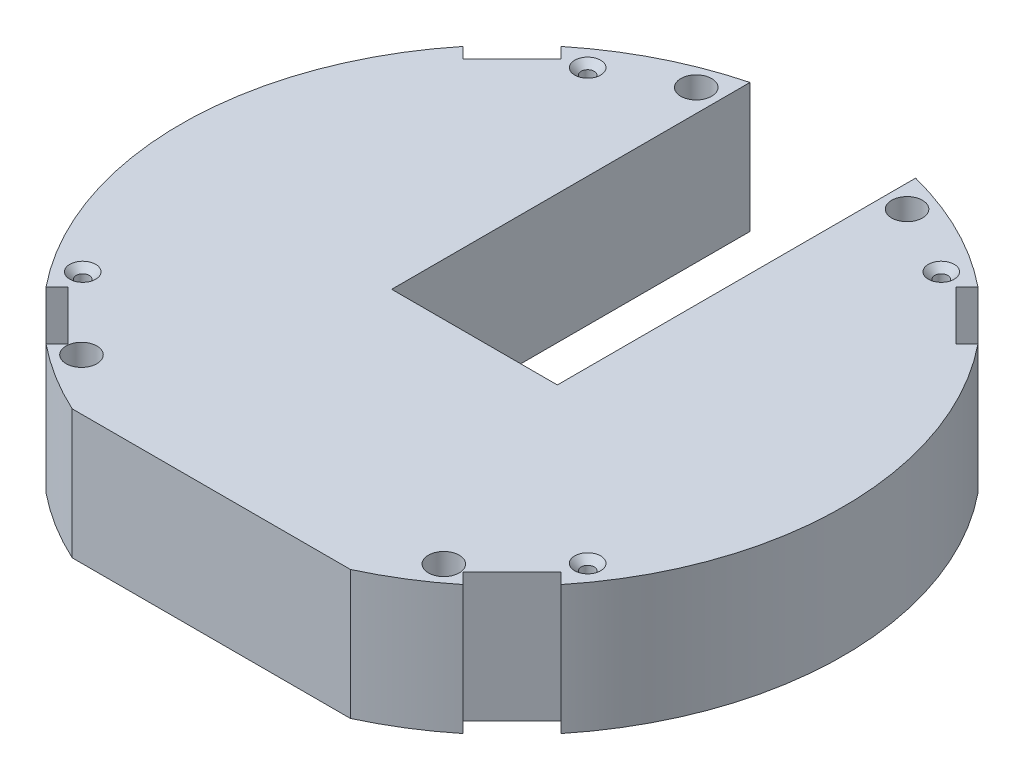
ISO-10303-21;
HEADER;
FILE_DESCRIPTION(('STEP AP214'),'2;1');
FILE_NAME('part.step','',(''),(''),'','','');
FILE_SCHEMA(('AUTOMOTIVE_DESIGN { 1 0 10303 214 1 1 1 1 }'));
ENDSEC;
DATA;
#1=APPLICATION_CONTEXT('core data for automotive mechanical design processes');
#2=APPLICATION_PROTOCOL_DEFINITION('international standard','automotive_design',2000,#1);
#3=PRODUCT_CONTEXT('',#1,'mechanical');
#4=PRODUCT('Part','Part','',(#3));
#5=PRODUCT_RELATED_PRODUCT_CATEGORY('part','',(#4));
#6=PRODUCT_DEFINITION_FORMATION('','',#4);
#7=PRODUCT_DEFINITION_CONTEXT('part definition',#1,'design');
#8=PRODUCT_DEFINITION('design','',#6,#7);
#9=PRODUCT_DEFINITION_SHAPE('','',#8);
#10=(LENGTH_UNIT() NAMED_UNIT(*) SI_UNIT(.MILLI.,.METRE.));
#11=(NAMED_UNIT(*) PLANE_ANGLE_UNIT() SI_UNIT($,.RADIAN.));
#12=(NAMED_UNIT(*) SI_UNIT($,.STERADIAN.) SOLID_ANGLE_UNIT());
#13=UNCERTAINTY_MEASURE_WITH_UNIT(LENGTH_MEASURE(1.E-05),#10,'distance_accuracy_value','');
#14=(GEOMETRIC_REPRESENTATION_CONTEXT(3) GLOBAL_UNCERTAINTY_ASSIGNED_CONTEXT((#13)) GLOBAL_UNIT_ASSIGNED_CONTEXT((#10,
#11,#12)) REPRESENTATION_CONTEXT('',''));
#15=CARTESIAN_POINT('',(0.,0.,0.));
#16=DIRECTION('',(0.,0.,1.));
#17=DIRECTION('',(1.,0.,0.));
#18=AXIS2_PLACEMENT_3D('',#15,#16,#17);
#19=CARTESIAN_POINT('',(0.,33.5,0.));
#20=DIRECTION('',(0.,-1.,0.));
#21=DIRECTION('',(0.,0.,-1.));
#22=AXIS2_PLACEMENT_3D('',#19,#20,#21);
#23=CYLINDRICAL_SURFACE('',#22,86.);
#24=CARTESIAN_POINT('',(0.,0.,0.));
#25=DIRECTION('',(0.,1.,0.));
#26=DIRECTION('',(0.,0.,1.));
#27=AXIS2_PLACEMENT_3D('',#24,#25,#26);
#28=CIRCLE('',#27,86.);
#29=CARTESIAN_POINT('',(-54.1133074261554,0.,66.8412294875132));
#30=VERTEX_POINT('',#29);
#31=CARTESIAN_POINT('',(-36.1,0.,78.0563258166819));
#32=VERTEX_POINT('',#31);
#33=EDGE_CURVE('E339',#30,#32,#28,.T.);
#34=ORIENTED_EDGE('',*,*,#33,.T.);
#35=DIRECTION('',(0.,-1.,0.));
#36=VECTOR('',#35,1.);
#37=CARTESIAN_POINT('',(-36.1,33.5,78.0563258166819));
#38=LINE('',#37,#36);
#39=CARTESIAN_POINT('',(-36.1,33.5,78.0563258166819));
#40=VERTEX_POINT('',#39);
#41=EDGE_CURVE('E11',#40,#32,#38,.T.);
#42=ORIENTED_EDGE('',*,*,#41,.F.);
#43=CARTESIAN_POINT('',(0.,33.5,0.));
#44=DIRECTION('',(0.,1.,0.));
#45=DIRECTION('',(0.,0.,1.));
#46=AXIS2_PLACEMENT_3D('',#43,#44,#45);
#47=CIRCLE('',#46,86.);
#48=CARTESIAN_POINT('',(-54.1133074261554,33.5,66.8412294875132));
#49=VERTEX_POINT('',#48);
#50=EDGE_CURVE('E340',#49,#40,#47,.T.);
#51=ORIENTED_EDGE('',*,*,#50,.F.);
#52=DIRECTION('',(0.,-1.,0.));
#53=VECTOR('',#52,1.);
#54=CARTESIAN_POINT('',(-54.1133074261554,33.5,66.8412294875132));
#55=LINE('',#54,#53);
#56=EDGE_CURVE('E364',#49,#30,#55,.T.);
#57=ORIENTED_EDGE('',*,*,#56,.T.);
#58=EDGE_LOOP('',(#34,#42,#51,#57));
#59=FACE_BOUND('',#58,.T.);
#60=ADVANCED_FACE('F37',(#59),#23,.T.);
#61=CARTESIAN_POINT('',(-36.1,33.5,78.0563258166819));
#62=DIRECTION('',(0.,0.,-1.));
#63=DIRECTION('',(-1.,0.,0.));
#64=AXIS2_PLACEMENT_3D('',#61,#62,#63);
#65=PLANE('',#64);
#66=DIRECTION('',(1.,0.,0.));
#67=VECTOR('',#66,1.);
#68=CARTESIAN_POINT('',(-36.1,0.,78.0563258166819));
#69=LINE('',#68,#67);
#70=CARTESIAN_POINT('',(36.1,0.,78.0563258166819));
#71=VERTEX_POINT('',#70);
#72=EDGE_CURVE('E367',#32,#71,#69,.T.);
#73=ORIENTED_EDGE('',*,*,#72,.T.);
#74=DIRECTION('',(0.,-1.,0.));
#75=VECTOR('',#74,1.);
#76=CARTESIAN_POINT('',(36.1,33.5,78.0563258166819));
#77=LINE('',#76,#75);
#78=CARTESIAN_POINT('',(36.1,33.5,78.0563258166819));
#79=VERTEX_POINT('',#78);
#80=EDGE_CURVE('E44',#79,#71,#77,.T.);
#81=ORIENTED_EDGE('',*,*,#80,.F.);
#82=DIRECTION('',(1.,0.,0.));
#83=VECTOR('',#82,1.);
#84=CARTESIAN_POINT('',(-36.1,33.5,78.0563258166819));
#85=LINE('',#84,#83);
#86=EDGE_CURVE('E343',#40,#79,#85,.T.);
#87=ORIENTED_EDGE('',*,*,#86,.F.);
#88=ORIENTED_EDGE('',*,*,#41,.T.);
#89=EDGE_LOOP('',(#73,#81,#87,#88));
#90=FACE_BOUND('',#89,.T.);
#91=ADVANCED_FACE('F462',(#90),#65,.F.);
#92=CARTESIAN_POINT('',(0.,33.5,0.));
#93=DIRECTION('',(0.,-1.,0.));
#94=DIRECTION('',(0.,0.,-1.));
#95=AXIS2_PLACEMENT_3D('',#92,#93,#94);
#96=CYLINDRICAL_SURFACE('',#95,86.);
#97=CARTESIAN_POINT('',(0.,0.,0.));
#98=DIRECTION('',(0.,1.,0.));
#99=DIRECTION('',(0.,0.,1.));
#100=AXIS2_PLACEMENT_3D('',#97,#98,#99);
#101=CIRCLE('',#100,86.);
#102=CARTESIAN_POINT('',(54.1133074261554,0.,66.8412294875132));
#103=VERTEX_POINT('',#102);
#104=EDGE_CURVE('E369',#71,#103,#101,.T.);
#105=ORIENTED_EDGE('',*,*,#104,.T.);
#106=DIRECTION('',(0.,-1.,0.));
#107=VECTOR('',#106,1.);
#108=CARTESIAN_POINT('',(54.1133074261554,33.5,66.8412294875132));
#109=LINE('',#108,#107);
#110=CARTESIAN_POINT('',(54.1133074261554,33.5,66.8412294875132));
#111=VERTEX_POINT('',#110);
#112=EDGE_CURVE('E417',#111,#103,#109,.T.);
#113=ORIENTED_EDGE('',*,*,#112,.F.);
#114=CARTESIAN_POINT('',(0.,33.5,0.));
#115=DIRECTION('',(0.,1.,0.));
#116=DIRECTION('',(0.,0.,1.));
#117=AXIS2_PLACEMENT_3D('',#114,#115,#116);
#118=CIRCLE('',#117,86.);
#119=EDGE_CURVE('E210',#79,#111,#118,.T.);
#120=ORIENTED_EDGE('',*,*,#119,.F.);
#121=ORIENTED_EDGE('',*,*,#80,.T.);
#122=EDGE_LOOP('',(#105,#113,#120,#121));
#123=FACE_BOUND('',#122,.T.);
#124=ADVANCED_FACE('F422',(#123),#96,.T.);
#125=CARTESIAN_POINT('',(0.,33.5,0.));
#126=DIRECTION('',(0.,-1.,0.));
#127=DIRECTION('',(0.,0.,-1.));
#128=AXIS2_PLACEMENT_3D('',#125,#126,#127);
#129=CYLINDRICAL_SURFACE('',#128,86.);
#130=CARTESIAN_POINT('',(0.,0.,0.));
#131=DIRECTION('',(0.,1.,0.));
#132=DIRECTION('',(0.,0.,1.));
#133=AXIS2_PLACEMENT_3D('',#130,#131,#132);
#134=CIRCLE('',#133,86.);
#135=CARTESIAN_POINT('',(66.8412294875132,0.,54.1133074261553));
#136=VERTEX_POINT('',#135);
#137=CARTESIAN_POINT('',(66.8412294875132,0.,-54.1133074261553));
#138=VERTEX_POINT('',#137);
#139=EDGE_CURVE('E372',#136,#138,#134,.T.);
#140=ORIENTED_EDGE('',*,*,#139,.T.);
#141=DIRECTION('',(0.,-1.,0.));
#142=VECTOR('',#141,1.);
#143=CARTESIAN_POINT('',(66.8412294875132,33.5,-54.1133074261553));
#144=LINE('',#143,#142);
#145=CARTESIAN_POINT('',(66.8412294875132,33.5,-54.1133074261553));
#146=VERTEX_POINT('',#145);
#147=EDGE_CURVE('E412',#146,#138,#144,.T.);
#148=ORIENTED_EDGE('',*,*,#147,.F.);
#149=CARTESIAN_POINT('',(0.,33.5,0.));
#150=DIRECTION('',(0.,1.,0.));
#151=DIRECTION('',(0.,0.,1.));
#152=AXIS2_PLACEMENT_3D('',#149,#150,#151);
#153=CIRCLE('',#152,86.);
#154=CARTESIAN_POINT('',(66.8412294875132,33.5,54.1133074261553));
#155=VERTEX_POINT('',#154);
#156=EDGE_CURVE('E347',#155,#146,#153,.T.);
#157=ORIENTED_EDGE('',*,*,#156,.F.);
#158=DIRECTION('',(0.,-1.,0.));
#159=VECTOR('',#158,1.);
#160=CARTESIAN_POINT('',(66.8412294875132,33.5,54.1133074261553));
#161=LINE('',#160,#159);
#162=EDGE_CURVE('E414',#155,#136,#161,.T.);
#163=ORIENTED_EDGE('',*,*,#162,.T.);
#164=EDGE_LOOP('',(#140,#148,#157,#163));
#165=FACE_BOUND('',#164,.T.);
#166=ADVANCED_FACE('F435',(#165),#129,.T.);
#167=CARTESIAN_POINT('',(0.,33.5,0.));
#168=DIRECTION('',(0.,-1.,0.));
#169=DIRECTION('',(0.,0.,-1.));
#170=AXIS2_PLACEMENT_3D('',#167,#168,#169);
#171=CYLINDRICAL_SURFACE('',#170,86.);
#172=CARTESIAN_POINT('',(0.,0.,0.));
#173=DIRECTION('',(0.,1.,0.));
#174=DIRECTION('',(0.,0.,1.));
#175=AXIS2_PLACEMENT_3D('',#172,#173,#174);
#176=CIRCLE('',#175,86.);
#177=CARTESIAN_POINT('',(54.1133074261554,0.,-66.8412294875132));
#178=VERTEX_POINT('',#177);
#179=CARTESIAN_POINT('',(21.5,0.,-83.2691419434595));
#180=VERTEX_POINT('',#179);
#181=EDGE_CURVE('E375',#178,#180,#176,.T.);
#182=ORIENTED_EDGE('',*,*,#181,.T.);
#183=DIRECTION('',(0.,-1.,0.));
#184=VECTOR('',#183,1.);
#185=CARTESIAN_POINT('',(21.5,33.5,-83.2691419434595));
#186=LINE('',#185,#184);
#187=CARTESIAN_POINT('',(21.5,33.5,-83.2691419434595));
#188=VERTEX_POINT('',#187);
#189=EDGE_CURVE('E406',#188,#180,#186,.T.);
#190=ORIENTED_EDGE('',*,*,#189,.F.);
#191=CARTESIAN_POINT('',(0.,33.5,0.));
#192=DIRECTION('',(0.,1.,0.));
#193=DIRECTION('',(0.,0.,1.));
#194=AXIS2_PLACEMENT_3D('',#191,#192,#193);
#195=CIRCLE('',#194,86.);
#196=CARTESIAN_POINT('',(54.1133074261554,33.5,-66.8412294875132));
#197=VERTEX_POINT('',#196);
#198=EDGE_CURVE('E350',#197,#188,#195,.T.);
#199=ORIENTED_EDGE('',*,*,#198,.F.);
#200=DIRECTION('',(0.,-1.,0.));
#201=VECTOR('',#200,1.);
#202=CARTESIAN_POINT('',(54.1133074261553,33.5,-66.8412294875132));
#203=LINE('',#202,#201);
#204=EDGE_CURVE('E409',#197,#178,#203,.T.);
#205=ORIENTED_EDGE('',*,*,#204,.T.);
#206=EDGE_LOOP('',(#182,#190,#199,#205));
#207=FACE_BOUND('',#206,.T.);
#208=ADVANCED_FACE('F446',(#207),#171,.T.);
#209=CARTESIAN_POINT('',(21.5,33.5,-83.2691419434595));
#210=DIRECTION('',(1.,0.,0.));
#211=DIRECTION('',(0.,0.,-1.));
#212=AXIS2_PLACEMENT_3D('',#209,#210,#211);
#213=PLANE('',#212);
#214=DIRECTION('',(0.,0.,1.));
#215=VECTOR('',#214,1.);
#216=CARTESIAN_POINT('',(21.5,0.,-83.2691419434595));
#217=LINE('',#216,#215);
#218=CARTESIAN_POINT('',(21.5,0.,9.73085805654054));
#219=VERTEX_POINT('',#218);
#220=EDGE_CURVE('E377',#180,#219,#217,.T.);
#221=ORIENTED_EDGE('',*,*,#220,.T.);
#222=DIRECTION('',(0.,-1.,0.));
#223=VECTOR('',#222,1.);
#224=CARTESIAN_POINT('',(21.5,33.5,9.73085805654054));
#225=LINE('',#224,#223);
#226=CARTESIAN_POINT('',(21.5,33.5,9.73085805654054));
#227=VERTEX_POINT('',#226);
#228=EDGE_CURVE('E403',#227,#219,#225,.T.);
#229=ORIENTED_EDGE('',*,*,#228,.F.);
#230=DIRECTION('',(0.,0.,1.));
#231=VECTOR('',#230,1.);
#232=CARTESIAN_POINT('',(21.5,33.5,-83.2691419434595));
#233=LINE('',#232,#231);
#234=EDGE_CURVE('E352',#188,#227,#233,.T.);
#235=ORIENTED_EDGE('',*,*,#234,.F.);
#236=ORIENTED_EDGE('',*,*,#189,.T.);
#237=EDGE_LOOP('',(#221,#229,#235,#236));
#238=FACE_BOUND('',#237,.T.);
#239=ADVANCED_FACE('F508',(#238),#213,.F.);
#240=CARTESIAN_POINT('',(-21.5,33.5,9.73085805654054));
#241=DIRECTION('',(0.,0.,1.));
#242=DIRECTION('',(1.,0.,0.));
#243=AXIS2_PLACEMENT_3D('',#240,#241,#242);
#244=PLANE('',#243);
#245=DIRECTION('',(-1.,0.,0.));
#246=VECTOR('',#245,1.);
#247=CARTESIAN_POINT('',(-21.5,0.,9.73085805654054));
#248=LINE('',#247,#246);
#249=CARTESIAN_POINT('',(-21.5,0.,9.73085805654054));
#250=VERTEX_POINT('',#249);
#251=EDGE_CURVE('E379',#219,#250,#248,.T.);
#252=ORIENTED_EDGE('',*,*,#251,.T.);
#253=DIRECTION('',(0.,-1.,0.));
#254=VECTOR('',#253,1.);
#255=CARTESIAN_POINT('',(-21.5,33.5,9.73085805654054));
#256=LINE('',#255,#254);
#257=CARTESIAN_POINT('',(-21.5,33.5,9.73085805654054));
#258=VERTEX_POINT('',#257);
#259=EDGE_CURVE('E400',#258,#250,#256,.T.);
#260=ORIENTED_EDGE('',*,*,#259,.F.);
#261=DIRECTION('',(-1.,0.,0.));
#262=VECTOR('',#261,1.);
#263=CARTESIAN_POINT('',(-21.5,33.5,9.73085805654054));
#264=LINE('',#263,#262);
#265=EDGE_CURVE('E354',#227,#258,#264,.T.);
#266=ORIENTED_EDGE('',*,*,#265,.F.);
#267=ORIENTED_EDGE('',*,*,#228,.T.);
#268=EDGE_LOOP('',(#252,#260,#266,#267));
#269=FACE_BOUND('',#268,.T.);
#270=ADVANCED_FACE('F505',(#269),#244,.F.);
#271=CARTESIAN_POINT('',(-21.5,33.5,-83.2691419434595));
#272=DIRECTION('',(-1.,0.,0.));
#273=DIRECTION('',(0.,0.,1.));
#274=AXIS2_PLACEMENT_3D('',#271,#272,#273);
#275=PLANE('',#274);
#276=DIRECTION('',(0.,0.,-1.));
#277=VECTOR('',#276,1.);
#278=CARTESIAN_POINT('',(-21.5,0.,-83.2691419434595));
#279=LINE('',#278,#277);
#280=CARTESIAN_POINT('',(-21.5,0.,-83.2691419434595));
#281=VERTEX_POINT('',#280);
#282=EDGE_CURVE('E381',#250,#281,#279,.T.);
#283=ORIENTED_EDGE('',*,*,#282,.T.);
#284=DIRECTION('',(0.,-1.,0.));
#285=VECTOR('',#284,1.);
#286=CARTESIAN_POINT('',(-21.5,33.5,-83.2691419434595));
#287=LINE('',#286,#285);
#288=CARTESIAN_POINT('',(-21.5,33.5,-83.2691419434595));
#289=VERTEX_POINT('',#288);
#290=EDGE_CURVE('E397',#289,#281,#287,.T.);
#291=ORIENTED_EDGE('',*,*,#290,.F.);
#292=DIRECTION('',(0.,0.,-1.));
#293=VECTOR('',#292,1.);
#294=CARTESIAN_POINT('',(-21.5,33.5,-83.2691419434595));
#295=LINE('',#294,#293);
#296=EDGE_CURVE('E356',#258,#289,#295,.T.);
#297=ORIENTED_EDGE('',*,*,#296,.F.);
#298=ORIENTED_EDGE('',*,*,#259,.T.);
#299=EDGE_LOOP('',(#283,#291,#297,#298));
#300=FACE_BOUND('',#299,.T.);
#301=ADVANCED_FACE('F501',(#300),#275,.F.);
#302=CARTESIAN_POINT('',(0.,33.5,0.));
#303=DIRECTION('',(0.,-1.,0.));
#304=DIRECTION('',(0.,0.,-1.));
#305=AXIS2_PLACEMENT_3D('',#302,#303,#304);
#306=CYLINDRICAL_SURFACE('',#305,86.);
#307=CARTESIAN_POINT('',(0.,0.,0.));
#308=DIRECTION('',(0.,1.,0.));
#309=DIRECTION('',(0.,0.,1.));
#310=AXIS2_PLACEMENT_3D('',#307,#308,#309);
#311=CIRCLE('',#310,86.);
#312=CARTESIAN_POINT('',(-54.1133074261554,0.,-66.8412294875132));
#313=VERTEX_POINT('',#312);
#314=EDGE_CURVE('E383',#281,#313,#311,.T.);
#315=ORIENTED_EDGE('',*,*,#314,.T.);
#316=DIRECTION('',(0.,-1.,0.));
#317=VECTOR('',#316,1.);
#318=CARTESIAN_POINT('',(-54.1133074261553,33.5,-66.8412294875132));
#319=LINE('',#318,#317);
#320=CARTESIAN_POINT('',(-54.1133074261554,33.5,-66.8412294875132));
#321=VERTEX_POINT('',#320);
#322=EDGE_CURVE('E395',#321,#313,#319,.T.);
#323=ORIENTED_EDGE('',*,*,#322,.F.);
#324=CARTESIAN_POINT('',(0.,33.5,0.));
#325=DIRECTION('',(0.,1.,0.));
#326=DIRECTION('',(0.,0.,1.));
#327=AXIS2_PLACEMENT_3D('',#324,#325,#326);
#328=CIRCLE('',#327,86.);
#329=EDGE_CURVE('E358',#289,#321,#328,.T.);
#330=ORIENTED_EDGE('',*,*,#329,.F.);
#331=ORIENTED_EDGE('',*,*,#290,.T.);
#332=EDGE_LOOP('',(#315,#323,#330,#331));
#333=FACE_BOUND('',#332,.T.);
#334=ADVANCED_FACE('F496',(#333),#306,.T.);
#335=CARTESIAN_POINT('',(0.,33.5,0.));
#336=DIRECTION('',(0.,-1.,0.));
#337=DIRECTION('',(0.,0.,-1.));
#338=AXIS2_PLACEMENT_3D('',#335,#336,#337);
#339=CYLINDRICAL_SURFACE('',#338,86.);
#340=CARTESIAN_POINT('',(0.,0.,0.));
#341=DIRECTION('',(0.,1.,0.));
#342=DIRECTION('',(0.,0.,1.));
#343=AXIS2_PLACEMENT_3D('',#340,#341,#342);
#344=CIRCLE('',#343,86.);
#345=CARTESIAN_POINT('',(-66.8412294875132,0.,-54.1133074261553));
#346=VERTEX_POINT('',#345);
#347=CARTESIAN_POINT('',(-66.8412294875132,0.,54.1133074261553));
#348=VERTEX_POINT('',#347);
#349=EDGE_CURVE('E344',#346,#348,#344,.T.);
#350=ORIENTED_EDGE('',*,*,#349,.T.);
#351=DIRECTION('',(0.,-1.,0.));
#352=VECTOR('',#351,1.);
#353=CARTESIAN_POINT('',(-66.8412294875132,33.5,54.1133074261553));
#354=LINE('',#353,#352);
#355=CARTESIAN_POINT('',(-66.8412294875132,33.5,54.1133074261553));
#356=VERTEX_POINT('',#355);
#357=EDGE_CURVE('E390',#356,#348,#354,.T.);
#358=ORIENTED_EDGE('',*,*,#357,.F.);
#359=CARTESIAN_POINT('',(0.,33.5,0.));
#360=DIRECTION('',(0.,1.,0.));
#361=DIRECTION('',(0.,0.,1.));
#362=AXIS2_PLACEMENT_3D('',#359,#360,#361);
#363=CIRCLE('',#362,86.);
#364=CARTESIAN_POINT('',(-66.8412294875132,33.5,-54.1133074261553));
#365=VERTEX_POINT('',#364);
#366=EDGE_CURVE('E361',#365,#356,#363,.T.);
#367=ORIENTED_EDGE('',*,*,#366,.F.);
#368=DIRECTION('',(0.,-1.,0.));
#369=VECTOR('',#368,1.);
#370=CARTESIAN_POINT('',(-66.8412294875132,33.5,-54.1133074261553));
#371=LINE('',#370,#369);
#372=EDGE_CURVE('E392',#365,#346,#371,.T.);
#373=ORIENTED_EDGE('',*,*,#372,.T.);
#374=EDGE_LOOP('',(#350,#358,#367,#373));
#375=FACE_BOUND('',#374,.T.);
#376=ADVANCED_FACE('F483',(#375),#339,.T.);
#377=CARTESIAN_POINT('',(0.,33.5,0.));
#378=DIRECTION('',(0.,1.,0.));
#379=DIRECTION('',(0.,0.,1.));
#380=AXIS2_PLACEMENT_3D('',#377,#378,#379);
#381=PLANE('',#380);
#382=DIRECTION('',(-0.707106781186548,0.,-0.707106781186547));
#383=VECTOR('',#382,1.);
#384=CARTESIAN_POINT('',(-54.1133074261554,33.5,-66.8412294875132));
#385=LINE('',#384,#383);
#386=CARTESIAN_POINT('',(-51.2848803014092,33.5,-64.012802362767));
#387=VERTEX_POINT('',#386);
#388=EDGE_CURVE('E229',#387,#321,#385,.T.);
#389=ORIENTED_EDGE('',*,*,#388,.F.);
#390=DIRECTION('',(0.707106781186547,0.,-0.707106781186548));
#391=VECTOR('',#390,1.);
#392=CARTESIAN_POINT('',(-51.2848803014092,33.5,-64.012802362767));
#393=LINE('',#392,#391);
#394=CARTESIAN_POINT('',(-64.012802362767,33.5,-51.2848803014092));
#395=VERTEX_POINT('',#394);
#396=EDGE_CURVE('E247',#395,#387,#393,.T.);
#397=ORIENTED_EDGE('',*,*,#396,.F.);
#398=DIRECTION('',(0.707106781186551,0.,0.707106781186544));
#399=VECTOR('',#398,1.);
#400=CARTESIAN_POINT('',(-64.012802362767,33.5,-51.2848803014092));
#401=LINE('',#400,#399);
#402=EDGE_CURVE('E250',#365,#395,#401,.T.);
#403=ORIENTED_EDGE('',*,*,#402,.F.);
#404=ORIENTED_EDGE('',*,*,#366,.T.);
#405=DIRECTION('',(-0.707106781186551,0.,0.707106781186544));
#406=VECTOR('',#405,1.);
#407=CARTESIAN_POINT('',(-64.012802362767,33.5,51.2848803014092));
#408=LINE('',#407,#406);
#409=CARTESIAN_POINT('',(-64.012802362767,33.5,51.2848803014092));
#410=VERTEX_POINT('',#409);
#411=EDGE_CURVE('E212',#410,#356,#408,.T.);
#412=ORIENTED_EDGE('',*,*,#411,.F.);
#413=DIRECTION('',(-0.707106781186547,0.,-0.707106781186548));
#414=VECTOR('',#413,1.);
#415=CARTESIAN_POINT('',(-51.2848803014092,33.5,64.012802362767));
#416=LINE('',#415,#414);
#417=CARTESIAN_POINT('',(-51.2848803014092,33.5,64.012802362767));
#418=VERTEX_POINT('',#417);
#419=EDGE_CURVE('E265',#418,#410,#416,.T.);
#420=ORIENTED_EDGE('',*,*,#419,.F.);
#421=DIRECTION('',(0.707106781186548,0.,-0.707106781186547));
#422=VECTOR('',#421,1.);
#423=CARTESIAN_POINT('',(-54.1133074261554,33.5,66.8412294875132));
#424=LINE('',#423,#422);
#425=EDGE_CURVE('E214',#49,#418,#424,.T.);
#426=ORIENTED_EDGE('',*,*,#425,.F.);
#427=ORIENTED_EDGE('',*,*,#50,.T.);
#428=ORIENTED_EDGE('',*,*,#86,.T.);
#429=ORIENTED_EDGE('',*,*,#119,.T.);
#430=DIRECTION('',(0.707106781186548,0.,0.707106781186547));
#431=VECTOR('',#430,1.);
#432=CARTESIAN_POINT('',(54.1133074261554,33.5,66.8412294875132));
#433=LINE('',#432,#431);
#434=CARTESIAN_POINT('',(51.2848803014092,33.5,64.012802362767));
#435=VERTEX_POINT('',#434);
#436=EDGE_CURVE('E188',#435,#111,#433,.T.);
#437=ORIENTED_EDGE('',*,*,#436,.F.);
#438=DIRECTION('',(-0.707106781186547,0.,0.707106781186548));
#439=VECTOR('',#438,1.);
#440=CARTESIAN_POINT('',(51.2848803014092,33.5,64.012802362767));
#441=LINE('',#440,#439);
#442=CARTESIAN_POINT('',(64.012802362767,33.5,51.2848803014092));
#443=VERTEX_POINT('',#442);
#444=EDGE_CURVE('E198',#443,#435,#441,.T.);
#445=ORIENTED_EDGE('',*,*,#444,.F.);
#446=DIRECTION('',(-0.707106781186551,0.,-0.707106781186544));
#447=VECTOR('',#446,1.);
#448=CARTESIAN_POINT('',(64.012802362767,33.5,51.2848803014092));
#449=LINE('',#448,#447);
#450=EDGE_CURVE('E204',#155,#443,#449,.T.);
#451=ORIENTED_EDGE('',*,*,#450,.F.);
#452=ORIENTED_EDGE('',*,*,#156,.T.);
#453=DIRECTION('',(0.707106781186551,0.,-0.707106781186544));
#454=VECTOR('',#453,1.);
#455=CARTESIAN_POINT('',(64.012802362767,33.5,-51.2848803014092));
#456=LINE('',#455,#454);
#457=CARTESIAN_POINT('',(64.012802362767,33.5,-51.2848803014092));
#458=VERTEX_POINT('',#457);
#459=EDGE_CURVE('E230',#458,#146,#456,.T.);
#460=ORIENTED_EDGE('',*,*,#459,.F.);
#461=DIRECTION('',(0.707106781186547,0.,0.707106781186548));
#462=VECTOR('',#461,1.);
#463=CARTESIAN_POINT('',(51.2848803014092,33.5,-64.012802362767));
#464=LINE('',#463,#462);
#465=CARTESIAN_POINT('',(51.2848803014092,33.5,-64.012802362767));
#466=VERTEX_POINT('',#465);
#467=EDGE_CURVE('E232',#466,#458,#464,.T.);
#468=ORIENTED_EDGE('',*,*,#467,.F.);
#469=DIRECTION('',(-0.707106781186548,0.,0.707106781186547));
#470=VECTOR('',#469,1.);
#471=CARTESIAN_POINT('',(54.1133074261554,33.5,-66.8412294875132));
#472=LINE('',#471,#470);
#473=EDGE_CURVE('E195',#197,#466,#472,.T.);
#474=ORIENTED_EDGE('',*,*,#473,.F.);
#475=ORIENTED_EDGE('',*,*,#198,.T.);
#476=ORIENTED_EDGE('',*,*,#234,.T.);
#477=ORIENTED_EDGE('',*,*,#265,.T.);
#478=ORIENTED_EDGE('',*,*,#296,.T.);
#479=ORIENTED_EDGE('',*,*,#329,.T.);
#480=EDGE_LOOP('',(#389,#397,#403,#404,#412,#420,#426,#427,#428,#429,#437,#445,#451,#452,#460,
#468,#474,#475,#476,#477,#478,#479));
#481=FACE_BOUND('',#480,.T.);
#482=CARTESIAN_POINT('',(27.3616114660536,33.5,-75.1754096628726));
#483=DIRECTION('',(0.,1.,0.));
#484=DIRECTION('',(0.,0.,-1.));
#485=AXIS2_PLACEMENT_3D('',#482,#483,#484);
#486=CIRCLE('',#485,4.00000000000001);
#487=CARTESIAN_POINT('',(27.3616114660536,33.5,-79.1754096628727));
#488=VERTEX_POINT('',#487);
#489=EDGE_CURVE('E293',#488,#488,#486,.T.);
#490=ORIENTED_EDGE('',*,*,#489,.F.);
#491=EDGE_LOOP('',(#490));
#492=FACE_BOUND('',#491,.T.);
#493=CARTESIAN_POINT('',(47.0228201833975,33.5,64.7213595499961));
#494=DIRECTION('',(0.,1.,0.));
#495=DIRECTION('',(0.,0.,-1.));
#496=AXIS2_PLACEMENT_3D('',#493,#494,#495);
#497=CIRCLE('',#496,4.00000000000001);
#498=CARTESIAN_POINT('',(47.0228201833975,33.5,60.7213595499961));
#499=VERTEX_POINT('',#498);
#500=EDGE_CURVE('E287',#499,#499,#497,.T.);
#501=ORIENTED_EDGE('',*,*,#500,.F.);
#502=EDGE_LOOP('',(#501));
#503=FACE_BOUND('',#502,.T.);
#504=CARTESIAN_POINT('',(-47.0228201833975,33.5,64.7213595499961));
#505=DIRECTION('',(0.,1.,0.));
#506=DIRECTION('',(0.,0.,1.));
#507=AXIS2_PLACEMENT_3D('',#504,#505,#506);
#508=CIRCLE('',#507,4.00000000000001);
#509=CARTESIAN_POINT('',(-47.0228201833975,33.5,68.7213595499961));
#510=VERTEX_POINT('',#509);
#511=EDGE_CURVE('E280',#510,#510,#508,.T.);
#512=ORIENTED_EDGE('',*,*,#511,.F.);
#513=EDGE_LOOP('',(#512));
#514=FACE_BOUND('',#513,.T.);
#515=CARTESIAN_POINT('',(-27.3616114660536,33.5,-75.1754096628726));
#516=DIRECTION('',(0.,1.,0.));
#517=DIRECTION('',(0.,0.,1.));
#518=AXIS2_PLACEMENT_3D('',#515,#516,#517);
#519=CIRCLE('',#518,4.00000000000001);
#520=CARTESIAN_POINT('',(-27.3616114660536,33.5,-71.1754096628726));
#521=VERTEX_POINT('',#520);
#522=EDGE_CURVE('E283',#521,#521,#519,.T.);
#523=ORIENTED_EDGE('',*,*,#522,.F.);
#524=EDGE_LOOP('',(#523));
#525=FACE_BOUND('',#524,.T.);
#526=CARTESIAN_POINT('',(45.8861149080833,33.5,-65.5321635431196));
#527=DIRECTION('',(0.,1.,0.));
#528=DIRECTION('',(0.,0.,1.));
#529=AXIS2_PLACEMENT_3D('',#526,#527,#528);
#530=CIRCLE('',#529,3.36);
#531=CARTESIAN_POINT('',(45.8861149080833,33.5,-62.1721635431196));
#532=VERTEX_POINT('',#531);
#533=EDGE_CURVE('E301',#532,#532,#530,.T.);
#534=ORIENTED_EDGE('',*,*,#533,.F.);
#535=EDGE_LOOP('',(#534));
#536=FACE_BOUND('',#535,.T.);
#537=CARTESIAN_POINT('',(65.5321635431191,33.5,45.886114908084));
#538=DIRECTION('',(0.,1.,0.));
#539=DIRECTION('',(0.,0.,1.));
#540=AXIS2_PLACEMENT_3D('',#537,#538,#539);
#541=CIRCLE('',#540,3.36);
#542=CARTESIAN_POINT('',(65.5321635431191,33.5,49.246114908084));
#543=VERTEX_POINT('',#542);
#544=EDGE_CURVE('E312',#543,#543,#541,.T.);
#545=ORIENTED_EDGE('',*,*,#544,.F.);
#546=EDGE_LOOP('',(#545));
#547=FACE_BOUND('',#546,.T.);
#548=CARTESIAN_POINT('',(-65.5321635431191,33.5,45.886114908084));
#549=DIRECTION('',(0.,1.,0.));
#550=DIRECTION('',(0.,0.,1.));
#551=AXIS2_PLACEMENT_3D('',#548,#549,#550);
#552=CIRCLE('',#551,3.36);
#553=CARTESIAN_POINT('',(-65.5321635431191,33.5,49.246114908084));
#554=VERTEX_POINT('',#553);
#555=EDGE_CURVE('E321',#554,#554,#552,.T.);
#556=ORIENTED_EDGE('',*,*,#555,.F.);
#557=EDGE_LOOP('',(#556));
#558=FACE_BOUND('',#557,.T.);
#559=CARTESIAN_POINT('',(-45.8861149080833,33.5,-65.5321635431196));
#560=DIRECTION('',(0.,1.,0.));
#561=DIRECTION('',(0.,0.,1.));
#562=AXIS2_PLACEMENT_3D('',#559,#560,#561);
#563=CIRCLE('',#562,3.36);
#564=CARTESIAN_POINT('',(-45.8861149080833,33.5,-62.1721635431196));
#565=VERTEX_POINT('',#564);
#566=EDGE_CURVE('E330',#565,#565,#563,.T.);
#567=ORIENTED_EDGE('',*,*,#566,.F.);
#568=EDGE_LOOP('',(#567));
#569=FACE_BOUND('',#568,.T.);
#570=ADVANCED_FACE('F207',(#481,#492,#503,#514,#525,#536,#547,#558,#569),#381,.T.);
#571=CARTESIAN_POINT('',(0.,0.,0.));
#572=DIRECTION('',(0.,1.,0.));
#573=DIRECTION('',(0.,0.,1.));
#574=AXIS2_PLACEMENT_3D('',#571,#572,#573);
#575=PLANE('',#574);
#576=CARTESIAN_POINT('',(27.3616114660536,0.,-75.1754096628726));
#577=DIRECTION('',(0.,1.,0.));
#578=DIRECTION('',(0.,0.,-1.));
#579=AXIS2_PLACEMENT_3D('',#576,#577,#578);
#580=CIRCLE('',#579,4.00000000000001);
#581=CARTESIAN_POINT('',(27.3616114660536,0.,-79.1754096628727));
#582=VERTEX_POINT('',#581);
#583=EDGE_CURVE('E278',#582,#582,#580,.T.);
#584=ORIENTED_EDGE('',*,*,#583,.T.);
#585=EDGE_LOOP('',(#584));
#586=FACE_BOUND('',#585,.T.);
#587=CARTESIAN_POINT('',(47.0228201833975,0.,64.7213595499961));
#588=DIRECTION('',(0.,1.,0.));
#589=DIRECTION('',(0.,0.,-1.));
#590=AXIS2_PLACEMENT_3D('',#587,#588,#589);
#591=CIRCLE('',#590,4.00000000000001);
#592=CARTESIAN_POINT('',(47.0228201833975,0.,60.7213595499961));
#593=VERTEX_POINT('',#592);
#594=EDGE_CURVE('E290',#593,#593,#591,.T.);
#595=ORIENTED_EDGE('',*,*,#594,.T.);
#596=EDGE_LOOP('',(#595));
#597=FACE_BOUND('',#596,.T.);
#598=CARTESIAN_POINT('',(-47.0228201833975,0.,64.7213595499961));
#599=DIRECTION('',(0.,1.,0.));
#600=DIRECTION('',(0.,0.,1.));
#601=AXIS2_PLACEMENT_3D('',#598,#599,#600);
#602=CIRCLE('',#601,4.00000000000001);
#603=CARTESIAN_POINT('',(-47.0228201833975,0.,68.7213595499961));
#604=VERTEX_POINT('',#603);
#605=EDGE_CURVE('E284',#604,#604,#602,.T.);
#606=ORIENTED_EDGE('',*,*,#605,.T.);
#607=EDGE_LOOP('',(#606));
#608=FACE_BOUND('',#607,.T.);
#609=CARTESIAN_POINT('',(-27.3616114660536,0.,-75.1754096628726));
#610=DIRECTION('',(0.,1.,0.));
#611=DIRECTION('',(0.,0.,1.));
#612=AXIS2_PLACEMENT_3D('',#609,#610,#611);
#613=CIRCLE('',#612,4.00000000000001);
#614=CARTESIAN_POINT('',(-27.3616114660536,0.,-71.1754096628726));
#615=VERTEX_POINT('',#614);
#616=EDGE_CURVE('E298',#615,#615,#613,.T.);
#617=ORIENTED_EDGE('',*,*,#616,.T.);
#618=EDGE_LOOP('',(#617));
#619=FACE_BOUND('',#618,.T.);
#620=CARTESIAN_POINT('',(45.8861149080833,0.,-65.5321635431196));
#621=DIRECTION('',(0.,1.,0.));
#622=DIRECTION('',(0.,0.,1.));
#623=AXIS2_PLACEMENT_3D('',#620,#621,#622);
#624=CIRCLE('',#623,1.69999999999999);
#625=CARTESIAN_POINT('',(45.8861149080833,0.,-63.8321635431196));
#626=VERTEX_POINT('',#625);
#627=EDGE_CURVE('E309',#626,#626,#624,.T.);
#628=ORIENTED_EDGE('',*,*,#627,.T.);
#629=EDGE_LOOP('',(#628));
#630=FACE_BOUND('',#629,.T.);
#631=CARTESIAN_POINT('',(65.5321635431191,0.,45.886114908084));
#632=DIRECTION('',(0.,1.,0.));
#633=DIRECTION('',(0.,0.,1.));
#634=AXIS2_PLACEMENT_3D('',#631,#632,#633);
#635=CIRCLE('',#634,1.69999999999999);
#636=CARTESIAN_POINT('',(65.5321635431191,0.,47.586114908084));
#637=VERTEX_POINT('',#636);
#638=EDGE_CURVE('E318',#637,#637,#635,.T.);
#639=ORIENTED_EDGE('',*,*,#638,.T.);
#640=EDGE_LOOP('',(#639));
#641=FACE_BOUND('',#640,.T.);
#642=CARTESIAN_POINT('',(-65.5321635431191,0.,45.886114908084));
#643=DIRECTION('',(0.,1.,0.));
#644=DIRECTION('',(0.,0.,1.));
#645=AXIS2_PLACEMENT_3D('',#642,#643,#644);
#646=CIRCLE('',#645,1.69999999999999);
#647=CARTESIAN_POINT('',(-65.5321635431191,0.,47.586114908084));
#648=VERTEX_POINT('',#647);
#649=EDGE_CURVE('E327',#648,#648,#646,.T.);
#650=ORIENTED_EDGE('',*,*,#649,.T.);
#651=EDGE_LOOP('',(#650));
#652=FACE_BOUND('',#651,.T.);
#653=CARTESIAN_POINT('',(-45.8861149080833,0.,-65.5321635431196));
#654=DIRECTION('',(0.,1.,0.));
#655=DIRECTION('',(0.,0.,1.));
#656=AXIS2_PLACEMENT_3D('',#653,#654,#655);
#657=CIRCLE('',#656,1.69999999999999);
#658=CARTESIAN_POINT('',(-45.8861149080833,0.,-63.8321635431196));
#659=VERTEX_POINT('',#658);
#660=EDGE_CURVE('E336',#659,#659,#657,.T.);
#661=ORIENTED_EDGE('',*,*,#660,.T.);
#662=EDGE_LOOP('',(#661));
#663=FACE_BOUND('',#662,.T.);
#664=DIRECTION('',(0.707106781186547,0.,-0.707106781186548));
#665=VECTOR('',#664,1.);
#666=CARTESIAN_POINT('',(-51.2848803014092,0.,-64.012802362767));
#667=LINE('',#666,#665);
#668=CARTESIAN_POINT('',(-64.012802362767,0.,-51.2848803014092));
#669=VERTEX_POINT('',#668);
#670=CARTESIAN_POINT('',(-51.2848803014092,0.,-64.012802362767));
#671=VERTEX_POINT('',#670);
#672=EDGE_CURVE('E51',#669,#671,#667,.T.);
#673=ORIENTED_EDGE('',*,*,#672,.T.);
#674=DIRECTION('',(-0.707106781186548,0.,-0.707106781186547));
#675=VECTOR('',#674,1.);
#676=CARTESIAN_POINT('',(-54.1133074261554,0.,-66.8412294875132));
#677=LINE('',#676,#675);
#678=EDGE_CURVE('E251',#671,#313,#677,.T.);
#679=ORIENTED_EDGE('',*,*,#678,.T.);
#680=ORIENTED_EDGE('',*,*,#314,.F.);
#681=ORIENTED_EDGE('',*,*,#282,.F.);
#682=ORIENTED_EDGE('',*,*,#251,.F.);
#683=ORIENTED_EDGE('',*,*,#220,.F.);
#684=ORIENTED_EDGE('',*,*,#181,.F.);
#685=DIRECTION('',(-0.707106781186548,0.,0.707106781186547));
#686=VECTOR('',#685,1.);
#687=CARTESIAN_POINT('',(54.1133074261554,0.,-66.8412294875132));
#688=LINE('',#687,#686);
#689=CARTESIAN_POINT('',(51.2848803014092,0.,-64.012802362767));
#690=VERTEX_POINT('',#689);
#691=EDGE_CURVE('E233',#178,#690,#688,.T.);
#692=ORIENTED_EDGE('',*,*,#691,.T.);
#693=DIRECTION('',(0.707106781186547,0.,0.707106781186548));
#694=VECTOR('',#693,1.);
#695=CARTESIAN_POINT('',(51.2848803014092,0.,-64.012802362767));
#696=LINE('',#695,#694);
#697=CARTESIAN_POINT('',(64.012802362767,0.,-51.2848803014092));
#698=VERTEX_POINT('',#697);
#699=EDGE_CURVE('E59',#690,#698,#696,.T.);
#700=ORIENTED_EDGE('',*,*,#699,.T.);
#701=DIRECTION('',(0.707106781186551,0.,-0.707106781186544));
#702=VECTOR('',#701,1.);
#703=CARTESIAN_POINT('',(64.012802362767,0.,-51.2848803014092));
#704=LINE('',#703,#702);
#705=EDGE_CURVE('E226',#698,#138,#704,.T.);
#706=ORIENTED_EDGE('',*,*,#705,.T.);
#707=ORIENTED_EDGE('',*,*,#139,.F.);
#708=DIRECTION('',(-0.707106781186551,0.,-0.707106781186544));
#709=VECTOR('',#708,1.);
#710=CARTESIAN_POINT('',(64.012802362767,0.,51.2848803014092));
#711=LINE('',#710,#709);
#712=CARTESIAN_POINT('',(64.012802362767,0.,51.2848803014092));
#713=VERTEX_POINT('',#712);
#714=EDGE_CURVE('E220',#136,#713,#711,.T.);
#715=ORIENTED_EDGE('',*,*,#714,.T.);
#716=DIRECTION('',(-0.707106781186547,0.,0.707106781186548));
#717=VECTOR('',#716,1.);
#718=CARTESIAN_POINT('',(51.2848803014092,0.,64.012802362767));
#719=LINE('',#718,#717);
#720=CARTESIAN_POINT('',(51.2848803014092,0.,64.012802362767));
#721=VERTEX_POINT('',#720);
#722=EDGE_CURVE('E218',#713,#721,#719,.T.);
#723=ORIENTED_EDGE('',*,*,#722,.T.);
#724=DIRECTION('',(0.707106781186548,0.,0.707106781186547));
#725=VECTOR('',#724,1.);
#726=CARTESIAN_POINT('',(54.1133074261554,0.,66.8412294875132));
#727=LINE('',#726,#725);
#728=EDGE_CURVE('E191',#721,#103,#727,.T.);
#729=ORIENTED_EDGE('',*,*,#728,.T.);
#730=ORIENTED_EDGE('',*,*,#104,.F.);
#731=ORIENTED_EDGE('',*,*,#72,.F.);
#732=ORIENTED_EDGE('',*,*,#33,.F.);
#733=DIRECTION('',(0.707106781186548,0.,-0.707106781186547));
#734=VECTOR('',#733,1.);
#735=CARTESIAN_POINT('',(-54.1133074261554,0.,66.8412294875132));
#736=LINE('',#735,#734);
#737=CARTESIAN_POINT('',(-51.2848803014092,0.,64.012802362767));
#738=VERTEX_POINT('',#737);
#739=EDGE_CURVE('E264',#30,#738,#736,.T.);
#740=ORIENTED_EDGE('',*,*,#739,.T.);
#741=DIRECTION('',(-0.707106781186547,0.,-0.707106781186548));
#742=VECTOR('',#741,1.);
#743=CARTESIAN_POINT('',(-51.2848803014092,0.,64.012802362767));
#744=LINE('',#743,#742);
#745=CARTESIAN_POINT('',(-64.012802362767,0.,51.2848803014092));
#746=VERTEX_POINT('',#745);
#747=EDGE_CURVE('E268',#738,#746,#744,.T.);
#748=ORIENTED_EDGE('',*,*,#747,.T.);
#749=DIRECTION('',(-0.707106781186551,0.,0.707106781186544));
#750=VECTOR('',#749,1.);
#751=CARTESIAN_POINT('',(-64.012802362767,0.,51.2848803014092));
#752=LINE('',#751,#750);
#753=EDGE_CURVE('E261',#746,#348,#752,.T.);
#754=ORIENTED_EDGE('',*,*,#753,.T.);
#755=ORIENTED_EDGE('',*,*,#349,.F.);
#756=DIRECTION('',(0.707106781186551,0.,0.707106781186544));
#757=VECTOR('',#756,1.);
#758=CARTESIAN_POINT('',(-64.012802362767,0.,-51.2848803014092));
#759=LINE('',#758,#757);
#760=EDGE_CURVE('E256',#346,#669,#759,.T.);
#761=ORIENTED_EDGE('',*,*,#760,.T.);
#762=EDGE_LOOP('',(#673,#679,#680,#681,#682,#683,#684,#692,#700,#706,#707,#715,#723,#729,#730,
#731,#732,#740,#748,#754,#755,#761));
#763=FACE_BOUND('',#762,.T.);
#764=ADVANCED_FACE('F425',(#586,#597,#608,#619,#630,#641,#652,#663,#763),#575,.F.);
#765=CARTESIAN_POINT('',(-45.8861149080833,33.5,-65.5321635431196));
#766=DIRECTION('',(0.,1.,0.));
#767=DIRECTION('',(0.,0.,1.));
#768=AXIS2_PLACEMENT_3D('',#765,#766,#767);
#769=CYLINDRICAL_SURFACE('',#768,1.69999999999999);
#770=ORIENTED_EDGE('',*,*,#660,.F.);
#771=EDGE_LOOP('',(#770));
#772=FACE_BOUND('',#771,.T.);
#773=CARTESIAN_POINT('',(-45.8861149080833,31.84,-65.5321635431196));
#774=DIRECTION('',(0.,1.,0.));
#775=DIRECTION('',(0.,0.,1.));
#776=AXIS2_PLACEMENT_3D('',#773,#774,#775);
#777=CIRCLE('',#776,1.69999999999999);
#778=CARTESIAN_POINT('',(-45.8861149080833,31.84,-63.8321635431196));
#779=VERTEX_POINT('',#778);
#780=EDGE_CURVE('E333',#779,#779,#777,.T.);
#781=ORIENTED_EDGE('',*,*,#780,.T.);
#782=EDGE_LOOP('',(#781));
#783=FACE_BOUND('',#782,.T.);
#784=ADVANCED_FACE('F574',(#772,#783),#769,.F.);
#785=CARTESIAN_POINT('',(-45.8861149080833,33.5,-65.5321635431196));
#786=DIRECTION('',(0.,1.,0.));
#787=DIRECTION('',(0.,0.,1.));
#788=AXIS2_PLACEMENT_3D('',#785,#786,#787);
#789=CONICAL_SURFACE('',#788,3.36,0.785398163397446);
#790=ORIENTED_EDGE('',*,*,#780,.F.);
#791=EDGE_LOOP('',(#790));
#792=FACE_BOUND('',#791,.T.);
#793=ORIENTED_EDGE('',*,*,#566,.T.);
#794=EDGE_LOOP('',(#793));
#795=FACE_BOUND('',#794,.T.);
#796=ADVANCED_FACE('F790',(#792,#795),#789,.F.);
#797=CARTESIAN_POINT('',(-65.5321635431191,33.5,45.886114908084));
#798=DIRECTION('',(0.,1.,0.));
#799=DIRECTION('',(0.,0.,1.));
#800=AXIS2_PLACEMENT_3D('',#797,#798,#799);
#801=CYLINDRICAL_SURFACE('',#800,1.69999999999999);
#802=ORIENTED_EDGE('',*,*,#649,.F.);
#803=EDGE_LOOP('',(#802));
#804=FACE_BOUND('',#803,.T.);
#805=CARTESIAN_POINT('',(-65.5321635431191,31.84,45.886114908084));
#806=DIRECTION('',(0.,1.,0.));
#807=DIRECTION('',(0.,0.,1.));
#808=AXIS2_PLACEMENT_3D('',#805,#806,#807);
#809=CIRCLE('',#808,1.69999999999999);
#810=CARTESIAN_POINT('',(-65.5321635431191,31.84,47.586114908084));
#811=VERTEX_POINT('',#810);
#812=EDGE_CURVE('E324',#811,#811,#809,.T.);
#813=ORIENTED_EDGE('',*,*,#812,.T.);
#814=EDGE_LOOP('',(#813));
#815=FACE_BOUND('',#814,.T.);
#816=ADVANCED_FACE('F780',(#804,#815),#801,.F.);
#817=CARTESIAN_POINT('',(-65.5321635431191,33.5,45.886114908084));
#818=DIRECTION('',(0.,1.,0.));
#819=DIRECTION('',(0.,0.,1.));
#820=AXIS2_PLACEMENT_3D('',#817,#818,#819);
#821=CONICAL_SURFACE('',#820,3.36,0.785398163397444);
#822=ORIENTED_EDGE('',*,*,#812,.F.);
#823=EDGE_LOOP('',(#822));
#824=FACE_BOUND('',#823,.T.);
#825=ORIENTED_EDGE('',*,*,#555,.T.);
#826=EDGE_LOOP('',(#825));
#827=FACE_BOUND('',#826,.T.);
#828=ADVANCED_FACE('F770',(#824,#827),#821,.F.);
#829=CARTESIAN_POINT('',(65.5321635431191,33.5,45.886114908084));
#830=DIRECTION('',(0.,1.,0.));
#831=DIRECTION('',(0.,0.,1.));
#832=AXIS2_PLACEMENT_3D('',#829,#830,#831);
#833=CYLINDRICAL_SURFACE('',#832,1.69999999999999);
#834=ORIENTED_EDGE('',*,*,#638,.F.);
#835=EDGE_LOOP('',(#834));
#836=FACE_BOUND('',#835,.T.);
#837=CARTESIAN_POINT('',(65.5321635431191,31.84,45.886114908084));
#838=DIRECTION('',(0.,1.,0.));
#839=DIRECTION('',(0.,0.,1.));
#840=AXIS2_PLACEMENT_3D('',#837,#838,#839);
#841=CIRCLE('',#840,1.69999999999999);
#842=CARTESIAN_POINT('',(65.5321635431191,31.84,47.586114908084));
#843=VERTEX_POINT('',#842);
#844=EDGE_CURVE('E315',#843,#843,#841,.T.);
#845=ORIENTED_EDGE('',*,*,#844,.T.);
#846=EDGE_LOOP('',(#845));
#847=FACE_BOUND('',#846,.T.);
#848=ADVANCED_FACE('F760',(#836,#847),#833,.F.);
#849=CARTESIAN_POINT('',(65.5321635431191,33.5,45.886114908084));
#850=DIRECTION('',(0.,1.,0.));
#851=DIRECTION('',(0.,0.,1.));
#852=AXIS2_PLACEMENT_3D('',#849,#850,#851);
#853=CONICAL_SURFACE('',#852,3.36,0.785398163397444);
#854=ORIENTED_EDGE('',*,*,#844,.F.);
#855=EDGE_LOOP('',(#854));
#856=FACE_BOUND('',#855,.T.);
#857=ORIENTED_EDGE('',*,*,#544,.T.);
#858=EDGE_LOOP('',(#857));
#859=FACE_BOUND('',#858,.T.);
#860=ADVANCED_FACE('F750',(#856,#859),#853,.F.);
#861=CARTESIAN_POINT('',(45.8861149080833,33.5,-65.5321635431196));
#862=DIRECTION('',(0.,1.,0.));
#863=DIRECTION('',(0.,0.,1.));
#864=AXIS2_PLACEMENT_3D('',#861,#862,#863);
#865=CYLINDRICAL_SURFACE('',#864,1.69999999999999);
#866=ORIENTED_EDGE('',*,*,#627,.F.);
#867=EDGE_LOOP('',(#866));
#868=FACE_BOUND('',#867,.T.);
#869=CARTESIAN_POINT('',(45.8861149080833,31.84,-65.5321635431196));
#870=DIRECTION('',(0.,1.,0.));
#871=DIRECTION('',(0.,0.,1.));
#872=AXIS2_PLACEMENT_3D('',#869,#870,#871);
#873=CIRCLE('',#872,1.69999999999999);
#874=CARTESIAN_POINT('',(45.8861149080833,31.84,-63.8321635431196));
#875=VERTEX_POINT('',#874);
#876=EDGE_CURVE('E306',#875,#875,#873,.T.);
#877=ORIENTED_EDGE('',*,*,#876,.T.);
#878=EDGE_LOOP('',(#877));
#879=FACE_BOUND('',#878,.T.);
#880=ADVANCED_FACE('F740',(#868,#879),#865,.F.);
#881=CARTESIAN_POINT('',(45.8861149080833,33.5,-65.5321635431196));
#882=DIRECTION('',(0.,1.,0.));
#883=DIRECTION('',(0.,0.,1.));
#884=AXIS2_PLACEMENT_3D('',#881,#882,#883);
#885=CONICAL_SURFACE('',#884,3.36,0.785398163397446);
#886=ORIENTED_EDGE('',*,*,#876,.F.);
#887=EDGE_LOOP('',(#886));
#888=FACE_BOUND('',#887,.T.);
#889=ORIENTED_EDGE('',*,*,#533,.T.);
#890=EDGE_LOOP('',(#889));
#891=FACE_BOUND('',#890,.T.);
#892=ADVANCED_FACE('F730',(#888,#891),#885,.F.);
#893=CARTESIAN_POINT('',(-27.3616114660536,0.,-75.1754096628726));
#894=DIRECTION('',(0.,1.,0.));
#895=DIRECTION('',(0.,0.,1.));
#896=AXIS2_PLACEMENT_3D('',#893,#894,#895);
#897=CYLINDRICAL_SURFACE('',#896,4.00000000000001);
#898=ORIENTED_EDGE('',*,*,#616,.F.);
#899=EDGE_LOOP('',(#898));
#900=FACE_BOUND('',#899,.T.);
#901=ORIENTED_EDGE('',*,*,#522,.T.);
#902=EDGE_LOOP('',(#901));
#903=FACE_BOUND('',#902,.T.);
#904=ADVANCED_FACE('F720',(#900,#903),#897,.F.);
#905=CARTESIAN_POINT('',(-47.0228201833975,0.,64.7213595499961));
#906=DIRECTION('',(0.,1.,0.));
#907=DIRECTION('',(0.,0.,1.));
#908=AXIS2_PLACEMENT_3D('',#905,#906,#907);
#909=CYLINDRICAL_SURFACE('',#908,4.00000000000001);
#910=ORIENTED_EDGE('',*,*,#605,.F.);
#911=EDGE_LOOP('',(#910));
#912=FACE_BOUND('',#911,.T.);
#913=ORIENTED_EDGE('',*,*,#511,.T.);
#914=EDGE_LOOP('',(#913));
#915=FACE_BOUND('',#914,.T.);
#916=ADVANCED_FACE('F710',(#912,#915),#909,.F.);
#917=CARTESIAN_POINT('',(47.0228201833975,0.,64.7213595499961));
#918=DIRECTION('',(0.,1.,0.));
#919=DIRECTION('',(0.,0.,1.));
#920=AXIS2_PLACEMENT_3D('',#917,#918,#919);
#921=CYLINDRICAL_SURFACE('',#920,4.00000000000001);
#922=ORIENTED_EDGE('',*,*,#594,.F.);
#923=EDGE_LOOP('',(#922));
#924=FACE_BOUND('',#923,.T.);
#925=ORIENTED_EDGE('',*,*,#500,.T.);
#926=EDGE_LOOP('',(#925));
#927=FACE_BOUND('',#926,.T.);
#928=ADVANCED_FACE('F700',(#924,#927),#921,.F.);
#929=CARTESIAN_POINT('',(27.3616114660536,0.,-75.1754096628726));
#930=DIRECTION('',(0.,1.,0.));
#931=DIRECTION('',(0.,0.,1.));
#932=AXIS2_PLACEMENT_3D('',#929,#930,#931);
#933=CYLINDRICAL_SURFACE('',#932,4.00000000000001);
#934=ORIENTED_EDGE('',*,*,#583,.F.);
#935=EDGE_LOOP('',(#934));
#936=FACE_BOUND('',#935,.T.);
#937=ORIENTED_EDGE('',*,*,#489,.T.);
#938=EDGE_LOOP('',(#937));
#939=FACE_BOUND('',#938,.T.);
#940=ADVANCED_FACE('F587',(#936,#939),#933,.F.);
#941=CARTESIAN_POINT('',(-64.012802362767,0.,51.2848803014092));
#942=DIRECTION('',(-0.707106781186544,0.,-0.707106781186551));
#943=DIRECTION('',(-0.707106781186551,0.,0.707106781186544));
#944=AXIS2_PLACEMENT_3D('',#941,#942,#943);
#945=PLANE('',#944);
#946=ORIENTED_EDGE('',*,*,#411,.T.);
#947=ORIENTED_EDGE('',*,*,#357,.T.);
#948=ORIENTED_EDGE('',*,*,#753,.F.);
#949=DIRECTION('',(0.,1.,0.));
#950=VECTOR('',#949,1.);
#951=CARTESIAN_POINT('',(-64.012802362767,0.,51.2848803014092));
#952=LINE('',#951,#950);
#953=EDGE_CURVE('E276',#746,#410,#952,.T.);
#954=ORIENTED_EDGE('',*,*,#953,.T.);
#955=EDGE_LOOP('',(#946,#947,#948,#954));
#956=FACE_BOUND('',#955,.T.);
#957=ADVANCED_FACE('F479',(#956),#945,.F.);
#958=CARTESIAN_POINT('',(-51.2848803014092,0.,64.012802362767));
#959=DIRECTION('',(0.707106781186548,0.,-0.707106781186547));
#960=DIRECTION('',(-0.707106781186547,0.,-0.707106781186548));
#961=AXIS2_PLACEMENT_3D('',#958,#959,#960);
#962=PLANE('',#961);
#963=ORIENTED_EDGE('',*,*,#419,.T.);
#964=ORIENTED_EDGE('',*,*,#953,.F.);
#965=ORIENTED_EDGE('',*,*,#747,.F.);
#966=DIRECTION('',(0.,1.,0.));
#967=VECTOR('',#966,1.);
#968=CARTESIAN_POINT('',(-51.2848803014092,0.,64.012802362767));
#969=LINE('',#968,#967);
#970=EDGE_CURVE('E270',#738,#418,#969,.T.);
#971=ORIENTED_EDGE('',*,*,#970,.T.);
#972=EDGE_LOOP('',(#963,#964,#965,#971));
#973=FACE_BOUND('',#972,.T.);
#974=ADVANCED_FACE('F475',(#973),#962,.F.);
#975=CARTESIAN_POINT('',(-54.1133074261554,0.,66.8412294875132));
#976=DIRECTION('',(0.707106781186547,0.,0.707106781186548));
#977=DIRECTION('',(0.707106781186548,0.,-0.707106781186547));
#978=AXIS2_PLACEMENT_3D('',#975,#976,#977);
#979=PLANE('',#978);
#980=ORIENTED_EDGE('',*,*,#425,.T.);
#981=ORIENTED_EDGE('',*,*,#970,.F.);
#982=ORIENTED_EDGE('',*,*,#739,.F.);
#983=ORIENTED_EDGE('',*,*,#56,.F.);
#984=EDGE_LOOP('',(#980,#981,#982,#983));
#985=FACE_BOUND('',#984,.T.);
#986=ADVANCED_FACE('F471',(#985),#979,.F.);
#987=CARTESIAN_POINT('',(54.1133074261554,0.,66.8412294875132));
#988=DIRECTION('',(-0.707106781186547,0.,0.707106781186548));
#989=DIRECTION('',(0.707106781186548,0.,0.707106781186547));
#990=AXIS2_PLACEMENT_3D('',#987,#988,#989);
#991=PLANE('',#990);
#992=ORIENTED_EDGE('',*,*,#436,.T.);
#993=ORIENTED_EDGE('',*,*,#112,.T.);
#994=ORIENTED_EDGE('',*,*,#728,.F.);
#995=DIRECTION('',(0.,1.,0.));
#996=VECTOR('',#995,1.);
#997=CARTESIAN_POINT('',(51.2848803014092,0.,64.012802362767));
#998=LINE('',#997,#996);
#999=EDGE_CURVE('E184',#721,#435,#998,.T.);
#1000=ORIENTED_EDGE('',*,*,#999,.T.);
#1001=EDGE_LOOP('',(#992,#993,#994,#1000));
#1002=FACE_BOUND('',#1001,.T.);
#1003=ADVANCED_FACE('F186',(#1002),#991,.F.);
#1004=CARTESIAN_POINT('',(51.2848803014092,0.,64.012802362767));
#1005=DIRECTION('',(-0.707106781186548,0.,-0.707106781186547));
#1006=DIRECTION('',(-0.707106781186547,0.,0.707106781186548));
#1007=AXIS2_PLACEMENT_3D('',#1004,#1005,#1006);
#1008=PLANE('',#1007);
#1009=ORIENTED_EDGE('',*,*,#444,.T.);
#1010=ORIENTED_EDGE('',*,*,#999,.F.);
#1011=ORIENTED_EDGE('',*,*,#722,.F.);
#1012=DIRECTION('',(0.,1.,0.));
#1013=VECTOR('',#1012,1.);
#1014=CARTESIAN_POINT('',(64.012802362767,0.,51.2848803014092));
#1015=LINE('',#1014,#1013);
#1016=EDGE_CURVE('E194',#713,#443,#1015,.T.);
#1017=ORIENTED_EDGE('',*,*,#1016,.T.);
#1018=EDGE_LOOP('',(#1009,#1010,#1011,#1017));
#1019=FACE_BOUND('',#1018,.T.);
#1020=ADVANCED_FACE('F199',(#1019),#1008,.F.);
#1021=CARTESIAN_POINT('',(64.012802362767,0.,51.2848803014092));
#1022=DIRECTION('',(0.707106781186544,0.,-0.707106781186551));
#1023=DIRECTION('',(-0.707106781186551,0.,-0.707106781186544));
#1024=AXIS2_PLACEMENT_3D('',#1021,#1022,#1023);
#1025=PLANE('',#1024);
#1026=ORIENTED_EDGE('',*,*,#450,.T.);
#1027=ORIENTED_EDGE('',*,*,#1016,.F.);
#1028=ORIENTED_EDGE('',*,*,#714,.F.);
#1029=ORIENTED_EDGE('',*,*,#162,.F.);
#1030=EDGE_LOOP('',(#1026,#1027,#1028,#1029));
#1031=FACE_BOUND('',#1030,.T.);
#1032=ADVANCED_FACE('F429',(#1031),#1025,.F.);
#1033=CARTESIAN_POINT('',(64.012802362767,0.,-51.2848803014092));
#1034=DIRECTION('',(0.707106781186544,0.,0.707106781186551));
#1035=DIRECTION('',(0.707106781186551,0.,-0.707106781186544));
#1036=AXIS2_PLACEMENT_3D('',#1033,#1034,#1035);
#1037=PLANE('',#1036);
#1038=ORIENTED_EDGE('',*,*,#459,.T.);
#1039=ORIENTED_EDGE('',*,*,#147,.T.);
#1040=ORIENTED_EDGE('',*,*,#705,.F.);
#1041=DIRECTION('',(0.,1.,0.));
#1042=VECTOR('',#1041,1.);
#1043=CARTESIAN_POINT('',(64.012802362767,0.,-51.2848803014092));
#1044=LINE('',#1043,#1042);
#1045=EDGE_CURVE('E227',#698,#458,#1044,.T.);
#1046=ORIENTED_EDGE('',*,*,#1045,.T.);
#1047=EDGE_LOOP('',(#1038,#1039,#1040,#1046));
#1048=FACE_BOUND('',#1047,.T.);
#1049=ADVANCED_FACE('F438',(#1048),#1037,.F.);
#1050=CARTESIAN_POINT('',(51.2848803014092,0.,-64.012802362767));
#1051=DIRECTION('',(-0.707106781186548,0.,0.707106781186547));
#1052=DIRECTION('',(0.707106781186547,0.,0.707106781186548));
#1053=AXIS2_PLACEMENT_3D('',#1050,#1051,#1052);
#1054=PLANE('',#1053);
#1055=ORIENTED_EDGE('',*,*,#467,.T.);
#1056=ORIENTED_EDGE('',*,*,#1045,.F.);
#1057=ORIENTED_EDGE('',*,*,#699,.F.);
#1058=DIRECTION('',(0.,1.,0.));
#1059=VECTOR('',#1058,1.);
#1060=CARTESIAN_POINT('',(51.2848803014092,0.,-64.012802362767));
#1061=LINE('',#1060,#1059);
#1062=EDGE_CURVE('E224',#690,#466,#1061,.T.);
#1063=ORIENTED_EDGE('',*,*,#1062,.T.);
#1064=EDGE_LOOP('',(#1055,#1056,#1057,#1063));
#1065=FACE_BOUND('',#1064,.T.);
#1066=ADVANCED_FACE('F451',(#1065),#1054,.F.);
#1067=CARTESIAN_POINT('',(54.1133074261554,0.,-66.8412294875132));
#1068=DIRECTION('',(-0.707106781186547,0.,-0.707106781186548));
#1069=DIRECTION('',(-0.707106781186548,0.,0.707106781186547));
#1070=AXIS2_PLACEMENT_3D('',#1067,#1068,#1069);
#1071=PLANE('',#1070);
#1072=ORIENTED_EDGE('',*,*,#473,.T.);
#1073=ORIENTED_EDGE('',*,*,#1062,.F.);
#1074=ORIENTED_EDGE('',*,*,#691,.F.);
#1075=ORIENTED_EDGE('',*,*,#204,.F.);
#1076=EDGE_LOOP('',(#1072,#1073,#1074,#1075));
#1077=FACE_BOUND('',#1076,.T.);
#1078=ADVANCED_FACE('F442',(#1077),#1071,.F.);
#1079=CARTESIAN_POINT('',(-54.1133074261554,0.,-66.8412294875132));
#1080=DIRECTION('',(0.707106781186547,0.,-0.707106781186548));
#1081=DIRECTION('',(-0.707106781186548,0.,-0.707106781186547));
#1082=AXIS2_PLACEMENT_3D('',#1079,#1080,#1081);
#1083=PLANE('',#1082);
#1084=ORIENTED_EDGE('',*,*,#388,.T.);
#1085=ORIENTED_EDGE('',*,*,#322,.T.);
#1086=ORIENTED_EDGE('',*,*,#678,.F.);
#1087=DIRECTION('',(0.,1.,0.));
#1088=VECTOR('',#1087,1.);
#1089=CARTESIAN_POINT('',(-51.2848803014092,0.,-64.012802362767));
#1090=LINE('',#1089,#1088);
#1091=EDGE_CURVE('E245',#671,#387,#1090,.T.);
#1092=ORIENTED_EDGE('',*,*,#1091,.T.);
#1093=EDGE_LOOP('',(#1084,#1085,#1086,#1092));
#1094=FACE_BOUND('',#1093,.T.);
#1095=ADVANCED_FACE('F458',(#1094),#1083,.F.);
#1096=CARTESIAN_POINT('',(-51.2848803014092,0.,-64.012802362767));
#1097=DIRECTION('',(0.707106781186548,0.,0.707106781186547));
#1098=DIRECTION('',(0.707106781186547,0.,-0.707106781186548));
#1099=AXIS2_PLACEMENT_3D('',#1096,#1097,#1098);
#1100=PLANE('',#1099);
#1101=ORIENTED_EDGE('',*,*,#396,.T.);
#1102=ORIENTED_EDGE('',*,*,#1091,.F.);
#1103=ORIENTED_EDGE('',*,*,#672,.F.);
#1104=DIRECTION('',(0.,1.,0.));
#1105=VECTOR('',#1104,1.);
#1106=CARTESIAN_POINT('',(-64.012802362767,0.,-51.2848803014092));
#1107=LINE('',#1106,#1105);
#1108=EDGE_CURVE('E243',#669,#395,#1107,.T.);
#1109=ORIENTED_EDGE('',*,*,#1108,.T.);
#1110=EDGE_LOOP('',(#1101,#1102,#1103,#1109));
#1111=FACE_BOUND('',#1110,.T.);
#1112=ADVANCED_FACE('F489',(#1111),#1100,.F.);
#1113=CARTESIAN_POINT('',(-64.012802362767,0.,-51.2848803014092));
#1114=DIRECTION('',(-0.707106781186544,0.,0.707106781186551));
#1115=DIRECTION('',(0.707106781186551,0.,0.707106781186544));
#1116=AXIS2_PLACEMENT_3D('',#1113,#1114,#1115);
#1117=PLANE('',#1116);
#1118=ORIENTED_EDGE('',*,*,#402,.T.);
#1119=ORIENTED_EDGE('',*,*,#1108,.F.);
#1120=ORIENTED_EDGE('',*,*,#760,.F.);
#1121=ORIENTED_EDGE('',*,*,#372,.F.);
#1122=EDGE_LOOP('',(#1118,#1119,#1120,#1121));
#1123=FACE_BOUND('',#1122,.T.);
#1124=ADVANCED_FACE('F487',(#1123),#1117,.F.);
#1125=CLOSED_SHELL('',(#60,#91,#124,#166,#208,#239,#270,#301,#334,#376,#570,#764,#784,#796,#816,
#828,#848,#860,#880,#892,#904,#916,#928,#940,#957,#974,#986,#1003,#1020,#1032,#1049,#1066,#1078,
#1095,#1112,#1124));
#1126=MANIFOLD_SOLID_BREP('B2',#1125);
#1127=ADVANCED_BREP_SHAPE_REPRESENTATION('',(#18,#1126),#14);
#1128=SHAPE_DEFINITION_REPRESENTATION(#9,#1127);
ENDSEC;
END-ISO-10303-21;
